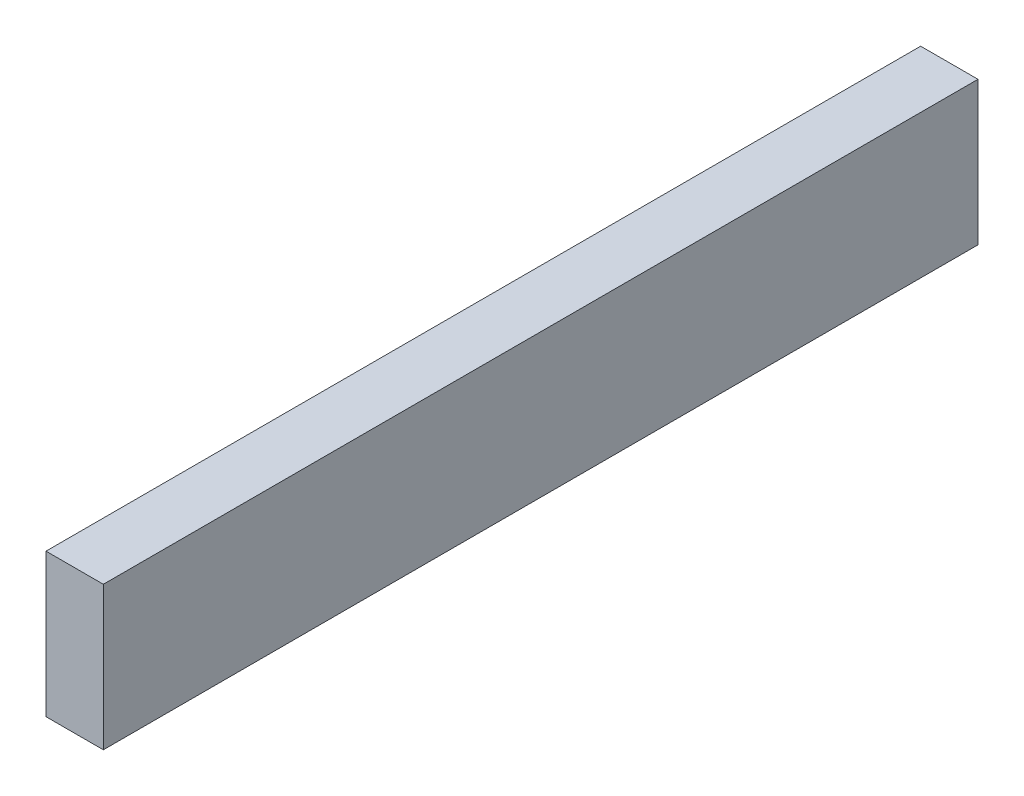
ISO-10303-21;
HEADER;
FILE_DESCRIPTION(('STEP AP214'),'2;1');
FILE_NAME('part.step','',(''),(''),'','','');
FILE_SCHEMA(('AUTOMOTIVE_DESIGN { 1 0 10303 214 1 1 1 1 }'));
ENDSEC;
DATA;
#1=APPLICATION_CONTEXT('core data for automotive mechanical design processes');
#2=APPLICATION_PROTOCOL_DEFINITION('international standard','automotive_design',2000,#1);
#3=PRODUCT_CONTEXT('',#1,'mechanical');
#4=PRODUCT('Part','Part','',(#3));
#5=PRODUCT_RELATED_PRODUCT_CATEGORY('part','',(#4));
#6=PRODUCT_DEFINITION_FORMATION('','',#4);
#7=PRODUCT_DEFINITION_CONTEXT('part definition',#1,'design');
#8=PRODUCT_DEFINITION('design','',#6,#7);
#9=PRODUCT_DEFINITION_SHAPE('','',#8);
#10=(LENGTH_UNIT() NAMED_UNIT(*) SI_UNIT(.MILLI.,.METRE.));
#11=(NAMED_UNIT(*) PLANE_ANGLE_UNIT() SI_UNIT($,.RADIAN.));
#12=(NAMED_UNIT(*) SI_UNIT($,.STERADIAN.) SOLID_ANGLE_UNIT());
#13=UNCERTAINTY_MEASURE_WITH_UNIT(LENGTH_MEASURE(1.E-05),#10,'distance_accuracy_value','');
#14=(GEOMETRIC_REPRESENTATION_CONTEXT(3) GLOBAL_UNCERTAINTY_ASSIGNED_CONTEXT((#13)) GLOBAL_UNIT_ASSIGNED_CONTEXT((#10,
#11,#12)) REPRESENTATION_CONTEXT('',''));
#15=CARTESIAN_POINT('',(0.,0.,0.));
#16=DIRECTION('',(0.,0.,1.));
#17=DIRECTION('',(1.,0.,0.));
#18=AXIS2_PLACEMENT_3D('',#15,#16,#17);
#19=CARTESIAN_POINT('',(4.,0.,0.));
#20=DIRECTION('',(0.,0.,-1.));
#21=DIRECTION('',(-1.,0.,0.));
#22=AXIS2_PLACEMENT_3D('',#19,#20,#21);
#23=PLANE('',#22);
#24=DIRECTION('',(0.,-1.,0.));
#25=VECTOR('',#24,1.);
#26=CARTESIAN_POINT('',(0.,0.,0.));
#27=LINE('',#26,#25);
#28=CARTESIAN_POINT('',(0.,10.,0.));
#29=VERTEX_POINT('',#28);
#30=CARTESIAN_POINT('',(0.,0.,0.));
#31=VERTEX_POINT('',#30);
#32=EDGE_CURVE('E113',#29,#31,#27,.T.);
#33=ORIENTED_EDGE('',*,*,#32,.T.);
#34=DIRECTION('',(-1.,0.,0.));
#35=VECTOR('',#34,1.);
#36=CARTESIAN_POINT('',(4.,0.,0.));
#37=LINE('',#36,#35);
#38=CARTESIAN_POINT('',(4.,0.,0.));
#39=VERTEX_POINT('',#38);
#40=EDGE_CURVE('E11',#39,#31,#37,.T.);
#41=ORIENTED_EDGE('',*,*,#40,.F.);
#42=DIRECTION('',(0.,-1.,0.));
#43=VECTOR('',#42,1.);
#44=CARTESIAN_POINT('',(4.,0.,0.));
#45=LINE('',#44,#43);
#46=CARTESIAN_POINT('',(4.,10.,0.));
#47=VERTEX_POINT('',#46);
#48=EDGE_CURVE('E97',#47,#39,#45,.T.);
#49=ORIENTED_EDGE('',*,*,#48,.F.);
#50=DIRECTION('',(-1.,0.,0.));
#51=VECTOR('',#50,1.);
#52=CARTESIAN_POINT('',(4.,10.,0.));
#53=LINE('',#52,#51);
#54=EDGE_CURVE('E109',#47,#29,#53,.T.);
#55=ORIENTED_EDGE('',*,*,#54,.T.);
#56=EDGE_LOOP('',(#33,#41,#49,#55));
#57=FACE_BOUND('',#56,.T.);
#58=ADVANCED_FACE('F45',(#57),#23,.F.);
#59=CARTESIAN_POINT('',(4.,0.,0.));
#60=DIRECTION('',(0.,1.,0.));
#61=DIRECTION('',(0.,0.,1.));
#62=AXIS2_PLACEMENT_3D('',#59,#60,#61);
#63=PLANE('',#62);
#64=DIRECTION('',(0.,0.,-1.));
#65=VECTOR('',#64,1.);
#66=CARTESIAN_POINT('',(0.,0.,0.));
#67=LINE('',#66,#65);
#68=CARTESIAN_POINT('',(0.,0.,-61.));
#69=VERTEX_POINT('',#68);
#70=EDGE_CURVE('E102',#31,#69,#67,.T.);
#71=ORIENTED_EDGE('',*,*,#70,.T.);
#72=DIRECTION('',(-1.,0.,0.));
#73=VECTOR('',#72,1.);
#74=CARTESIAN_POINT('',(4.,0.,-61.));
#75=LINE('',#74,#73);
#76=CARTESIAN_POINT('',(4.,0.,-61.));
#77=VERTEX_POINT('',#76);
#78=EDGE_CURVE('E54',#77,#69,#75,.T.);
#79=ORIENTED_EDGE('',*,*,#78,.F.);
#80=DIRECTION('',(0.,0.,-1.));
#81=VECTOR('',#80,1.);
#82=CARTESIAN_POINT('',(4.,0.,0.));
#83=LINE('',#82,#81);
#84=EDGE_CURVE('E92',#39,#77,#83,.T.);
#85=ORIENTED_EDGE('',*,*,#84,.F.);
#86=ORIENTED_EDGE('',*,*,#40,.T.);
#87=EDGE_LOOP('',(#71,#79,#85,#86));
#88=FACE_BOUND('',#87,.T.);
#89=ADVANCED_FACE('F101',(#88),#63,.F.);
#90=CARTESIAN_POINT('',(4.,0.,-61.));
#91=DIRECTION('',(0.,0.,1.));
#92=DIRECTION('',(1.,0.,0.));
#93=AXIS2_PLACEMENT_3D('',#90,#91,#92);
#94=PLANE('',#93);
#95=DIRECTION('',(0.,1.,0.));
#96=VECTOR('',#95,1.);
#97=CARTESIAN_POINT('',(0.,0.,-61.));
#98=LINE('',#97,#96);
#99=CARTESIAN_POINT('',(0.,10.,-61.));
#100=VERTEX_POINT('',#99);
#101=EDGE_CURVE('E79',#69,#100,#98,.T.);
#102=ORIENTED_EDGE('',*,*,#101,.T.);
#103=DIRECTION('',(-1.,0.,0.));
#104=VECTOR('',#103,1.);
#105=CARTESIAN_POINT('',(4.,10.,-61.));
#106=LINE('',#105,#104);
#107=CARTESIAN_POINT('',(4.,10.,-61.));
#108=VERTEX_POINT('',#107);
#109=EDGE_CURVE('E104',#108,#100,#106,.T.);
#110=ORIENTED_EDGE('',*,*,#109,.F.);
#111=DIRECTION('',(0.,1.,0.));
#112=VECTOR('',#111,1.);
#113=CARTESIAN_POINT('',(4.,0.,-61.));
#114=LINE('',#113,#112);
#115=EDGE_CURVE('E95',#77,#108,#114,.T.);
#116=ORIENTED_EDGE('',*,*,#115,.F.);
#117=ORIENTED_EDGE('',*,*,#78,.T.);
#118=EDGE_LOOP('',(#102,#110,#116,#117));
#119=FACE_BOUND('',#118,.T.);
#120=ADVANCED_FACE('F105',(#119),#94,.F.);
#121=CARTESIAN_POINT('',(4.,10.,0.));
#122=DIRECTION('',(0.,-1.,0.));
#123=DIRECTION('',(0.,0.,-1.));
#124=AXIS2_PLACEMENT_3D('',#121,#122,#123);
#125=PLANE('',#124);
#126=DIRECTION('',(0.,0.,1.));
#127=VECTOR('',#126,1.);
#128=CARTESIAN_POINT('',(0.,10.,0.));
#129=LINE('',#128,#127);
#130=EDGE_CURVE('E85',#100,#29,#129,.T.);
#131=ORIENTED_EDGE('',*,*,#130,.T.);
#132=ORIENTED_EDGE('',*,*,#54,.F.);
#133=DIRECTION('',(0.,0.,1.));
#134=VECTOR('',#133,1.);
#135=CARTESIAN_POINT('',(4.,10.,0.));
#136=LINE('',#135,#134);
#137=EDGE_CURVE('E62',#108,#47,#136,.T.);
#138=ORIENTED_EDGE('',*,*,#137,.F.);
#139=ORIENTED_EDGE('',*,*,#109,.T.);
#140=EDGE_LOOP('',(#131,#132,#138,#139));
#141=FACE_BOUND('',#140,.T.);
#142=ADVANCED_FACE('F126',(#141),#125,.F.);
#143=CARTESIAN_POINT('',(4.,0.,0.));
#144=DIRECTION('',(-1.,0.,0.));
#145=DIRECTION('',(0.,0.,1.));
#146=AXIS2_PLACEMENT_3D('',#143,#144,#145);
#147=PLANE('',#146);
#148=ORIENTED_EDGE('',*,*,#48,.T.);
#149=ORIENTED_EDGE('',*,*,#84,.T.);
#150=ORIENTED_EDGE('',*,*,#115,.T.);
#151=ORIENTED_EDGE('',*,*,#137,.T.);
#152=EDGE_LOOP('',(#148,#149,#150,#151));
#153=FACE_BOUND('',#152,.T.);
#154=ADVANCED_FACE('F93',(#153),#147,.F.);
#155=CARTESIAN_POINT('',(0.,0.,0.));
#156=DIRECTION('',(-1.,0.,0.));
#157=DIRECTION('',(0.,0.,1.));
#158=AXIS2_PLACEMENT_3D('',#155,#156,#157);
#159=PLANE('',#158);
#160=ORIENTED_EDGE('',*,*,#32,.F.);
#161=ORIENTED_EDGE('',*,*,#130,.F.);
#162=ORIENTED_EDGE('',*,*,#101,.F.);
#163=ORIENTED_EDGE('',*,*,#70,.F.);
#164=EDGE_LOOP('',(#160,#161,#162,#163));
#165=FACE_BOUND('',#164,.T.);
#166=ADVANCED_FACE('F129',(#165),#159,.T.);
#167=CLOSED_SHELL('',(#58,#89,#120,#142,#154,#166));
#168=MANIFOLD_SOLID_BREP('B2',#167);
#169=ADVANCED_BREP_SHAPE_REPRESENTATION('',(#18,#168),#14);
#170=SHAPE_DEFINITION_REPRESENTATION(#9,#169);
ENDSEC;
END-ISO-10303-21;
